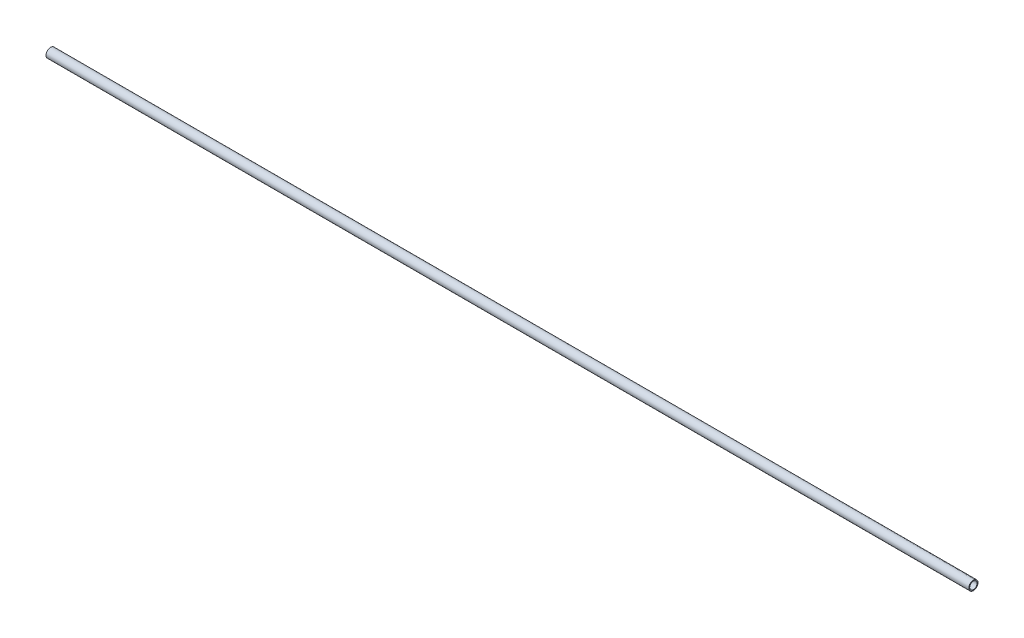
ISO-10303-21;
HEADER;
FILE_DESCRIPTION(('STEP AP214'),'2;1');
FILE_NAME('part.step','',(''),(''),'','','');
FILE_SCHEMA(('AUTOMOTIVE_DESIGN { 1 0 10303 214 1 1 1 1 }'));
ENDSEC;
DATA;
#1=APPLICATION_CONTEXT('core data for automotive mechanical design processes');
#2=APPLICATION_PROTOCOL_DEFINITION('international standard','automotive_design',2000,#1);
#3=PRODUCT_CONTEXT('',#1,'mechanical');
#4=PRODUCT('Part','Part','',(#3));
#5=PRODUCT_RELATED_PRODUCT_CATEGORY('part','',(#4));
#6=PRODUCT_DEFINITION_FORMATION('','',#4);
#7=PRODUCT_DEFINITION_CONTEXT('part definition',#1,'design');
#8=PRODUCT_DEFINITION('design','',#6,#7);
#9=PRODUCT_DEFINITION_SHAPE('','',#8);
#10=(LENGTH_UNIT() NAMED_UNIT(*) SI_UNIT(.MILLI.,.METRE.));
#11=(NAMED_UNIT(*) PLANE_ANGLE_UNIT() SI_UNIT($,.RADIAN.));
#12=(NAMED_UNIT(*) SI_UNIT($,.STERADIAN.) SOLID_ANGLE_UNIT());
#13=UNCERTAINTY_MEASURE_WITH_UNIT(LENGTH_MEASURE(1.E-05),#10,'distance_accuracy_value','');
#14=(GEOMETRIC_REPRESENTATION_CONTEXT(3) GLOBAL_UNCERTAINTY_ASSIGNED_CONTEXT((#13)) GLOBAL_UNIT_ASSIGNED_CONTEXT((#10,
#11,#12)) REPRESENTATION_CONTEXT('',''));
#15=CARTESIAN_POINT('',(0.,0.,0.));
#16=DIRECTION('',(0.,0.,1.));
#17=DIRECTION('',(1.,0.,0.));
#18=AXIS2_PLACEMENT_3D('',#15,#16,#17);
#19=CARTESIAN_POINT('',(500.,0.,0.));
#20=DIRECTION('',(1.,0.,0.));
#21=DIRECTION('',(0.,0.,-1.));
#22=AXIS2_PLACEMENT_3D('',#19,#20,#21);
#23=PLANE('',#22);
#24=CARTESIAN_POINT('',(500.,0.,0.));
#25=DIRECTION('',(1.,0.,0.));
#26=DIRECTION('',(0.,0.,-1.));
#27=AXIS2_PLACEMENT_3D('',#24,#25,#26);
#28=CIRCLE('',#27,5.);
#29=CARTESIAN_POINT('',(500.,0.,-5.));
#30=VERTEX_POINT('',#29);
#31=EDGE_CURVE('E10',#30,#30,#28,.T.);
#32=ORIENTED_EDGE('',*,*,#31,.T.);
#33=EDGE_LOOP('',(#32));
#34=FACE_BOUND('',#33,.T.);
#35=CARTESIAN_POINT('',(500.,0.,0.));
#36=DIRECTION('',(1.,0.,0.));
#37=DIRECTION('',(0.,0.,-1.));
#38=AXIS2_PLACEMENT_3D('',#35,#36,#37);
#39=CIRCLE('',#38,4.);
#40=CARTESIAN_POINT('',(500.,0.,-4.));
#41=VERTEX_POINT('',#40);
#42=EDGE_CURVE('E48',#41,#41,#39,.T.);
#43=ORIENTED_EDGE('',*,*,#42,.F.);
#44=EDGE_LOOP('',(#43));
#45=FACE_BOUND('',#44,.T.);
#46=ADVANCED_FACE('F40',(#34,#45),#23,.T.);
#47=CARTESIAN_POINT('',(-500.,0.,0.));
#48=DIRECTION('',(1.,0.,0.));
#49=DIRECTION('',(0.,0.,-1.));
#50=AXIS2_PLACEMENT_3D('',#47,#48,#49);
#51=PLANE('',#50);
#52=CARTESIAN_POINT('',(-500.,0.,0.));
#53=DIRECTION('',(1.,0.,0.));
#54=DIRECTION('',(0.,0.,-1.));
#55=AXIS2_PLACEMENT_3D('',#52,#53,#54);
#56=CIRCLE('',#55,5.);
#57=CARTESIAN_POINT('',(-500.,0.,-5.));
#58=VERTEX_POINT('',#57);
#59=EDGE_CURVE('E41',#58,#58,#56,.T.);
#60=ORIENTED_EDGE('',*,*,#59,.F.);
#61=EDGE_LOOP('',(#60));
#62=FACE_BOUND('',#61,.T.);
#63=CARTESIAN_POINT('',(-500.,0.,0.));
#64=DIRECTION('',(1.,0.,0.));
#65=DIRECTION('',(0.,0.,-1.));
#66=AXIS2_PLACEMENT_3D('',#63,#64,#65);
#67=CIRCLE('',#66,4.);
#68=CARTESIAN_POINT('',(-500.,0.,-4.));
#69=VERTEX_POINT('',#68);
#70=EDGE_CURVE('E49',#69,#69,#67,.T.);
#71=ORIENTED_EDGE('',*,*,#70,.T.);
#72=EDGE_LOOP('',(#71));
#73=FACE_BOUND('',#72,.T.);
#74=ADVANCED_FACE('F58',(#62,#73),#51,.F.);
#75=CARTESIAN_POINT('',(500.,0.,0.));
#76=DIRECTION('',(-1.,0.,0.));
#77=DIRECTION('',(0.,0.,1.));
#78=AXIS2_PLACEMENT_3D('',#75,#76,#77);
#79=CYLINDRICAL_SURFACE('',#78,5.);
#80=ORIENTED_EDGE('',*,*,#31,.F.);
#81=EDGE_LOOP('',(#80));
#82=FACE_BOUND('',#81,.T.);
#83=ORIENTED_EDGE('',*,*,#59,.T.);
#84=EDGE_LOOP('',(#83));
#85=FACE_BOUND('',#84,.T.);
#86=ADVANCED_FACE('F39',(#82,#85),#79,.T.);
#87=CARTESIAN_POINT('',(500.,0.,0.));
#88=DIRECTION('',(-1.,0.,0.));
#89=DIRECTION('',(0.,0.,1.));
#90=AXIS2_PLACEMENT_3D('',#87,#88,#89);
#91=CYLINDRICAL_SURFACE('',#90,4.);
#92=ORIENTED_EDGE('',*,*,#42,.T.);
#93=EDGE_LOOP('',(#92));
#94=FACE_BOUND('',#93,.T.);
#95=ORIENTED_EDGE('',*,*,#70,.F.);
#96=EDGE_LOOP('',(#95));
#97=FACE_BOUND('',#96,.T.);
#98=ADVANCED_FACE('F57',(#94,#97),#91,.F.);
#99=CLOSED_SHELL('',(#46,#74,#86,#98));
#100=MANIFOLD_SOLID_BREP('B2',#99);
#101=ADVANCED_BREP_SHAPE_REPRESENTATION('',(#18,#100),#14);
#102=SHAPE_DEFINITION_REPRESENTATION(#9,#101);
ENDSEC;
END-ISO-10303-21;
